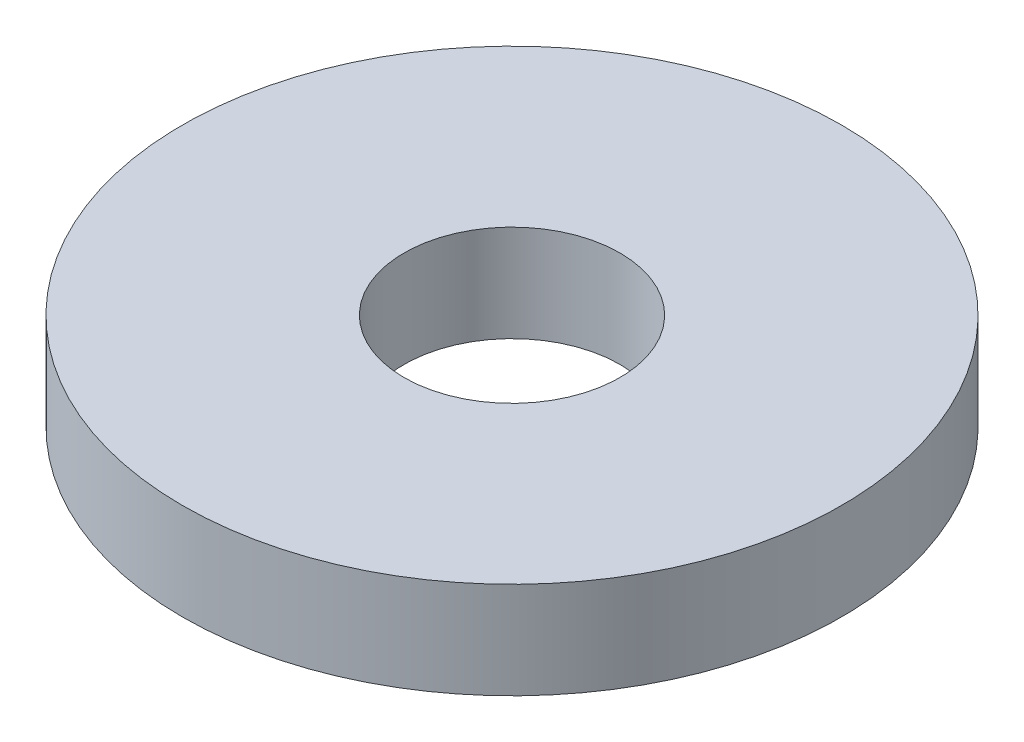
ISO-10303-21;
HEADER;
FILE_DESCRIPTION(('STEP AP214'),'2;1');
FILE_NAME('part.step','',(''),(''),'','','');
FILE_SCHEMA(('AUTOMOTIVE_DESIGN { 1 0 10303 214 1 1 1 1 }'));
ENDSEC;
DATA;
#1=APPLICATION_CONTEXT('core data for automotive mechanical design processes');
#2=APPLICATION_PROTOCOL_DEFINITION('international standard','automotive_design',2000,#1);
#3=PRODUCT_CONTEXT('',#1,'mechanical');
#4=PRODUCT('Part','Part','',(#3));
#5=PRODUCT_RELATED_PRODUCT_CATEGORY('part','',(#4));
#6=PRODUCT_DEFINITION_FORMATION('','',#4);
#7=PRODUCT_DEFINITION_CONTEXT('part definition',#1,'design');
#8=PRODUCT_DEFINITION('design','',#6,#7);
#9=PRODUCT_DEFINITION_SHAPE('','',#8);
#10=(LENGTH_UNIT() NAMED_UNIT(*) SI_UNIT(.MILLI.,.METRE.));
#11=(NAMED_UNIT(*) PLANE_ANGLE_UNIT() SI_UNIT($,.RADIAN.));
#12=(NAMED_UNIT(*) SI_UNIT($,.STERADIAN.) SOLID_ANGLE_UNIT());
#13=UNCERTAINTY_MEASURE_WITH_UNIT(LENGTH_MEASURE(1.E-05),#10,'distance_accuracy_value','');
#14=(GEOMETRIC_REPRESENTATION_CONTEXT(3) GLOBAL_UNCERTAINTY_ASSIGNED_CONTEXT((#13)) GLOBAL_UNIT_ASSIGNED_CONTEXT((#10,
#11,#12)) REPRESENTATION_CONTEXT('',''));
#15=CARTESIAN_POINT('',(0.,0.,0.));
#16=DIRECTION('',(0.,0.,1.));
#17=DIRECTION('',(1.,0.,0.));
#18=AXIS2_PLACEMENT_3D('',#15,#16,#17);
#19=CARTESIAN_POINT('',(0.,3.0226,0.));
#20=DIRECTION('',(0.,-1.,0.));
#21=DIRECTION('',(0.,0.,-1.));
#22=AXIS2_PLACEMENT_3D('',#19,#20,#21);
#23=CYLINDRICAL_SURFACE('',#22,10.3124);
#24=CARTESIAN_POINT('',(0.,3.0226,0.));
#25=DIRECTION('',(0.,1.,0.));
#26=DIRECTION('',(0.,0.,1.));
#27=AXIS2_PLACEMENT_3D('',#24,#25,#26);
#28=CIRCLE('',#27,10.3124);
#29=CARTESIAN_POINT('',(0.,3.0226,10.3124));
#30=VERTEX_POINT('',#29);
#31=EDGE_CURVE('E10',#30,#30,#28,.T.);
#32=ORIENTED_EDGE('',*,*,#31,.F.);
#33=EDGE_LOOP('',(#32));
#34=FACE_BOUND('',#33,.T.);
#35=CARTESIAN_POINT('',(0.,0.,0.));
#36=DIRECTION('',(0.,1.,0.));
#37=DIRECTION('',(0.,0.,1.));
#38=AXIS2_PLACEMENT_3D('',#35,#36,#37);
#39=CIRCLE('',#38,10.3124);
#40=CARTESIAN_POINT('',(0.,0.,10.3124));
#41=VERTEX_POINT('',#40);
#42=EDGE_CURVE('E32',#41,#41,#39,.T.);
#43=ORIENTED_EDGE('',*,*,#42,.T.);
#44=EDGE_LOOP('',(#43));
#45=FACE_BOUND('',#44,.T.);
#46=ADVANCED_FACE('F29',(#34,#45),#23,.T.);
#47=CARTESIAN_POINT('',(0.,3.0226,0.));
#48=DIRECTION('',(0.,1.,0.));
#49=DIRECTION('',(0.,0.,1.));
#50=AXIS2_PLACEMENT_3D('',#47,#48,#49);
#51=PLANE('',#50);
#52=CARTESIAN_POINT('',(0.,3.0226,0.));
#53=DIRECTION('',(0.,1.,0.));
#54=DIRECTION('',(0.,0.,1.));
#55=AXIS2_PLACEMENT_3D('',#52,#53,#54);
#56=CIRCLE('',#55,3.3782);
#57=CARTESIAN_POINT('',(0.,3.0226,3.3782));
#58=VERTEX_POINT('',#57);
#59=EDGE_CURVE('E41',#58,#58,#56,.T.);
#60=ORIENTED_EDGE('',*,*,#59,.F.);
#61=EDGE_LOOP('',(#60));
#62=FACE_BOUND('',#61,.T.);
#63=ORIENTED_EDGE('',*,*,#31,.T.);
#64=EDGE_LOOP('',(#63));
#65=FACE_BOUND('',#64,.T.);
#66=ADVANCED_FACE('F56',(#62,#65),#51,.T.);
#67=CARTESIAN_POINT('',(0.,0.,0.));
#68=DIRECTION('',(0.,1.,0.));
#69=DIRECTION('',(0.,0.,1.));
#70=AXIS2_PLACEMENT_3D('',#67,#68,#69);
#71=PLANE('',#70);
#72=CARTESIAN_POINT('',(0.,0.,0.));
#73=DIRECTION('',(0.,1.,0.));
#74=DIRECTION('',(0.,0.,1.));
#75=AXIS2_PLACEMENT_3D('',#72,#73,#74);
#76=CIRCLE('',#75,3.3782);
#77=CARTESIAN_POINT('',(0.,0.,3.3782));
#78=VERTEX_POINT('',#77);
#79=EDGE_CURVE('E39',#78,#78,#76,.T.);
#80=ORIENTED_EDGE('',*,*,#79,.T.);
#81=EDGE_LOOP('',(#80));
#82=FACE_BOUND('',#81,.T.);
#83=ORIENTED_EDGE('',*,*,#42,.F.);
#84=EDGE_LOOP('',(#83));
#85=FACE_BOUND('',#84,.T.);
#86=ADVANCED_FACE('F47',(#82,#85),#71,.F.);
#87=CARTESIAN_POINT('',(0.,0.,0.));
#88=DIRECTION('',(0.,1.,0.));
#89=DIRECTION('',(0.,0.,1.));
#90=AXIS2_PLACEMENT_3D('',#87,#88,#89);
#91=CYLINDRICAL_SURFACE('',#90,3.3782);
#92=ORIENTED_EDGE('',*,*,#79,.F.);
#93=EDGE_LOOP('',(#92));
#94=FACE_BOUND('',#93,.T.);
#95=ORIENTED_EDGE('',*,*,#59,.T.);
#96=EDGE_LOOP('',(#95));
#97=FACE_BOUND('',#96,.T.);
#98=ADVANCED_FACE('F50',(#94,#97),#91,.F.);
#99=CLOSED_SHELL('',(#46,#66,#86,#98));
#100=MANIFOLD_SOLID_BREP('B2',#99);
#101=ADVANCED_BREP_SHAPE_REPRESENTATION('',(#18,#100),#14);
#102=SHAPE_DEFINITION_REPRESENTATION(#9,#101);
ENDSEC;
END-ISO-10303-21;
